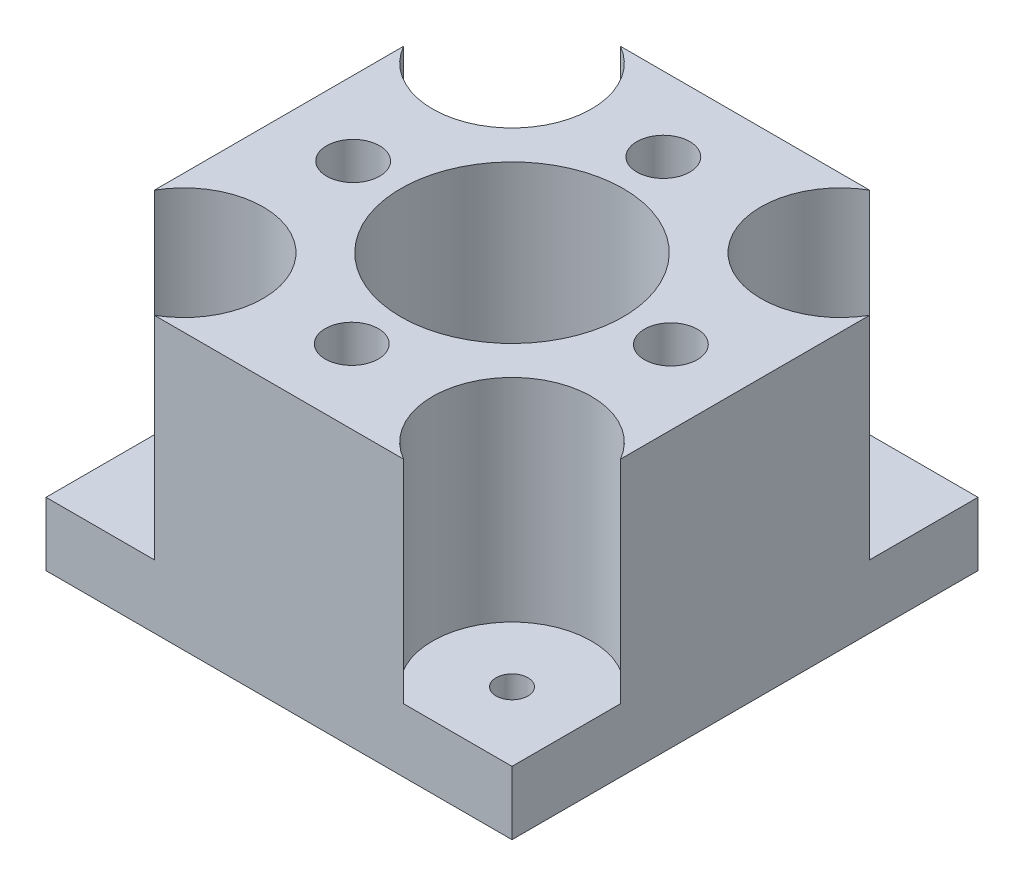
ISO-10303-21;
HEADER;
FILE_DESCRIPTION(('STEP AP214'),'2;1');
FILE_NAME('part.step','',(''),(''),'','','');
FILE_SCHEMA(('AUTOMOTIVE_DESIGN { 1 0 10303 214 1 1 1 1 }'));
ENDSEC;
DATA;
#1=APPLICATION_CONTEXT('core data for automotive mechanical design processes');
#2=APPLICATION_PROTOCOL_DEFINITION('international standard','automotive_design',2000,#1);
#3=PRODUCT_CONTEXT('',#1,'mechanical');
#4=PRODUCT('Part','Part','',(#3));
#5=PRODUCT_RELATED_PRODUCT_CATEGORY('part','',(#4));
#6=PRODUCT_DEFINITION_FORMATION('','',#4);
#7=PRODUCT_DEFINITION_CONTEXT('part definition',#1,'design');
#8=PRODUCT_DEFINITION('design','',#6,#7);
#9=PRODUCT_DEFINITION_SHAPE('','',#8);
#10=(LENGTH_UNIT() NAMED_UNIT(*) SI_UNIT(.MILLI.,.METRE.));
#11=(NAMED_UNIT(*) PLANE_ANGLE_UNIT() SI_UNIT($,.RADIAN.));
#12=(NAMED_UNIT(*) SI_UNIT($,.STERADIAN.) SOLID_ANGLE_UNIT());
#13=UNCERTAINTY_MEASURE_WITH_UNIT(LENGTH_MEASURE(1.E-05),#10,'distance_accuracy_value','');
#14=(GEOMETRIC_REPRESENTATION_CONTEXT(3) GLOBAL_UNCERTAINTY_ASSIGNED_CONTEXT((#13)) GLOBAL_UNIT_ASSIGNED_CONTEXT((#10,
#11,#12)) REPRESENTATION_CONTEXT('',''));
#15=CARTESIAN_POINT('',(0.,0.,0.));
#16=DIRECTION('',(0.,0.,1.));
#17=DIRECTION('',(1.,0.,0.));
#18=AXIS2_PLACEMENT_3D('',#15,#16,#17);
#19=CARTESIAN_POINT('',(0.,0.,0.));
#20=DIRECTION('',(0.,-1.,0.));
#21=DIRECTION('',(0.,0.,-1.));
#22=AXIS2_PLACEMENT_3D('',#19,#20,#21);
#23=PLANE('',#22);
#24=CARTESIAN_POINT('',(15.,0.,0.));
#25=DIRECTION('',(0.,-1.,0.));
#26=DIRECTION('',(0.,0.,-1.));
#27=AXIS2_PLACEMENT_3D('',#24,#25,#26);
#28=CIRCLE('',#27,2.5);
#29=CARTESIAN_POINT('',(15.,0.,-2.5));
#30=VERTEX_POINT('',#29);
#31=EDGE_CURVE('E259',#30,#30,#28,.T.);
#32=ORIENTED_EDGE('',*,*,#31,.F.);
#33=EDGE_LOOP('',(#32));
#34=FACE_BOUND('',#33,.T.);
#35=CARTESIAN_POINT('',(-15.,0.,0.));
#36=DIRECTION('',(0.,-1.,0.));
#37=DIRECTION('',(0.,0.,-1.));
#38=AXIS2_PLACEMENT_3D('',#35,#36,#37);
#39=CIRCLE('',#38,2.5);
#40=CARTESIAN_POINT('',(-15.,0.,-2.5));
#41=VERTEX_POINT('',#40);
#42=EDGE_CURVE('E309',#41,#41,#39,.T.);
#43=ORIENTED_EDGE('',*,*,#42,.F.);
#44=EDGE_LOOP('',(#43));
#45=FACE_BOUND('',#44,.T.);
#46=CARTESIAN_POINT('',(-0.695414312257709,0.,-14.9838712933043));
#47=DIRECTION('',(0.,-1.,0.));
#48=DIRECTION('',(0.,0.,-1.));
#49=AXIS2_PLACEMENT_3D('',#46,#47,#48);
#50=CIRCLE('',#49,2.5);
#51=CARTESIAN_POINT('',(-0.695414312257709,0.,-17.4838712933043));
#52=VERTEX_POINT('',#51);
#53=EDGE_CURVE('E306',#52,#52,#50,.T.);
#54=ORIENTED_EDGE('',*,*,#53,.F.);
#55=EDGE_LOOP('',(#54));
#56=FACE_BOUND('',#55,.T.);
#57=CARTESIAN_POINT('',(-0.115302399352741,0.,15.0161287066957));
#58=DIRECTION('',(0.,-1.,0.));
#59=DIRECTION('',(0.,0.,-1.));
#60=AXIS2_PLACEMENT_3D('',#57,#58,#59);
#61=CIRCLE('',#60,2.5);
#62=CARTESIAN_POINT('',(-0.115302399352741,0.,12.5161287066957));
#63=VERTEX_POINT('',#62);
#64=EDGE_CURVE('E295',#63,#63,#61,.T.);
#65=ORIENTED_EDGE('',*,*,#64,.F.);
#66=EDGE_LOOP('',(#65));
#67=FACE_BOUND('',#66,.T.);
#68=CARTESIAN_POINT('',(0.,0.,0.));
#69=DIRECTION('',(0.,-1.,0.));
#70=DIRECTION('',(0.,0.,-1.));
#71=AXIS2_PLACEMENT_3D('',#68,#69,#70);
#72=CIRCLE('',#71,10.5);
#73=CARTESIAN_POINT('',(0.,0.,-10.5));
#74=VERTEX_POINT('',#73);
#75=EDGE_CURVE('E164',#74,#74,#72,.T.);
#76=ORIENTED_EDGE('',*,*,#75,.F.);
#77=EDGE_LOOP('',(#76));
#78=FACE_BOUND('',#77,.T.);
#79=CARTESIAN_POINT('',(15.5,0.,15.5));
#80=DIRECTION('',(0.,1.,0.));
#81=DIRECTION('',(0.,0.,1.));
#82=AXIS2_PLACEMENT_3D('',#79,#80,#81);
#83=CIRCLE('',#82,1.5);
#84=CARTESIAN_POINT('',(15.5,0.,17.));
#85=VERTEX_POINT('',#84);
#86=EDGE_CURVE('E167',#85,#85,#83,.T.);
#87=ORIENTED_EDGE('',*,*,#86,.T.);
#88=EDGE_LOOP('',(#87));
#89=FACE_BOUND('',#88,.T.);
#90=CARTESIAN_POINT('',(15.5,0.,-15.5));
#91=DIRECTION('',(0.,1.,0.));
#92=DIRECTION('',(0.,0.,1.));
#93=AXIS2_PLACEMENT_3D('',#90,#91,#92);
#94=CIRCLE('',#93,1.5);
#95=CARTESIAN_POINT('',(15.5,0.,-14.));
#96=VERTEX_POINT('',#95);
#97=EDGE_CURVE('E208',#96,#96,#94,.T.);
#98=ORIENTED_EDGE('',*,*,#97,.T.);
#99=EDGE_LOOP('',(#98));
#100=FACE_BOUND('',#99,.T.);
#101=DIRECTION('',(0.,0.,-1.));
#102=VECTOR('',#101,1.);
#103=CARTESIAN_POINT('',(22.,0.,22.));
#104=LINE('',#103,#102);
#105=CARTESIAN_POINT('',(22.,0.,22.));
#106=VERTEX_POINT('',#105);
#107=CARTESIAN_POINT('',(22.,0.,-22.));
#108=VERTEX_POINT('',#107);
#109=EDGE_CURVE('E214',#106,#108,#104,.T.);
#110=ORIENTED_EDGE('',*,*,#109,.F.);
#111=DIRECTION('',(1.,0.,0.));
#112=VECTOR('',#111,1.);
#113=CARTESIAN_POINT('',(-22.,0.,22.));
#114=LINE('',#113,#112);
#115=CARTESIAN_POINT('',(-22.,0.,22.));
#116=VERTEX_POINT('',#115);
#117=EDGE_CURVE('E220',#116,#106,#114,.T.);
#118=ORIENTED_EDGE('',*,*,#117,.F.);
#119=DIRECTION('',(0.,0.,1.));
#120=VECTOR('',#119,1.);
#121=CARTESIAN_POINT('',(-22.,0.,22.));
#122=LINE('',#121,#120);
#123=CARTESIAN_POINT('',(-22.,0.,-22.));
#124=VERTEX_POINT('',#123);
#125=EDGE_CURVE('E218',#124,#116,#122,.T.);
#126=ORIENTED_EDGE('',*,*,#125,.F.);
#127=DIRECTION('',(-1.,0.,0.));
#128=VECTOR('',#127,1.);
#129=CARTESIAN_POINT('',(-22.,0.,-22.));
#130=LINE('',#129,#128);
#131=EDGE_CURVE('E153',#108,#124,#130,.T.);
#132=ORIENTED_EDGE('',*,*,#131,.F.);
#133=EDGE_LOOP('',(#110,#118,#126,#132));
#134=FACE_BOUND('',#133,.T.);
#135=CARTESIAN_POINT('',(-15.5,0.,-15.5));
#136=DIRECTION('',(0.,1.,0.));
#137=DIRECTION('',(0.,0.,1.));
#138=AXIS2_PLACEMENT_3D('',#135,#136,#137);
#139=CIRCLE('',#138,1.5);
#140=CARTESIAN_POINT('',(-15.5,0.,-14.));
#141=VERTEX_POINT('',#140);
#142=EDGE_CURVE('E211',#141,#141,#139,.T.);
#143=ORIENTED_EDGE('',*,*,#142,.T.);
#144=EDGE_LOOP('',(#143));
#145=FACE_BOUND('',#144,.T.);
#146=CARTESIAN_POINT('',(-15.5,0.,15.5));
#147=DIRECTION('',(0.,1.,0.));
#148=DIRECTION('',(0.,0.,1.));
#149=AXIS2_PLACEMENT_3D('',#146,#147,#148);
#150=CIRCLE('',#149,1.5);
#151=CARTESIAN_POINT('',(-15.5,0.,17.));
#152=VERTEX_POINT('',#151);
#153=EDGE_CURVE('E205',#152,#152,#150,.T.);
#154=ORIENTED_EDGE('',*,*,#153,.T.);
#155=EDGE_LOOP('',(#154));
#156=FACE_BOUND('',#155,.T.);
#157=ADVANCED_FACE('F37',(#34,#45,#56,#67,#78,#89,#100,#134,#145,#156),#23,.T.);
#158=CARTESIAN_POINT('',(22.,3.,22.));
#159=DIRECTION('',(-1.,0.,0.));
#160=DIRECTION('',(0.,0.,1.));
#161=AXIS2_PLACEMENT_3D('',#158,#159,#160);
#162=PLANE('',#161);
#163=DIRECTION('',(0.,0.,-1.));
#164=VECTOR('',#163,1.);
#165=CARTESIAN_POINT('',(22.,26.,22.));
#166=LINE('',#165,#164);
#167=CARTESIAN_POINT('',(22.,26.,11.7583426132261));
#168=VERTEX_POINT('',#167);
#169=CARTESIAN_POINT('',(22.,26.,-11.7583426132261));
#170=VERTEX_POINT('',#169);
#171=EDGE_CURVE('E194',#168,#170,#166,.T.);
#172=ORIENTED_EDGE('',*,*,#171,.F.);
#173=DIRECTION('',(0.,1.,0.));
#174=VECTOR('',#173,1.);
#175=CARTESIAN_POINT('',(22.,6.,11.7583426132261));
#176=LINE('',#175,#174);
#177=CARTESIAN_POINT('',(22.,6.,11.7583426132261));
#178=VERTEX_POINT('',#177);
#179=EDGE_CURVE('E60',#168,#178,#176,.F.);
#180=ORIENTED_EDGE('',*,*,#179,.T.);
#181=DIRECTION('',(0.,0.,-1.));
#182=VECTOR('',#181,1.);
#183=CARTESIAN_POINT('',(22.,6.,22.));
#184=LINE('',#183,#182);
#185=CARTESIAN_POINT('',(22.,6.,22.));
#186=VERTEX_POINT('',#185);
#187=EDGE_CURVE('E225',#186,#178,#184,.T.);
#188=ORIENTED_EDGE('',*,*,#187,.F.);
#189=DIRECTION('',(0.,-1.,0.));
#190=VECTOR('',#189,1.);
#191=CARTESIAN_POINT('',(22.,3.,22.));
#192=LINE('',#191,#190);
#193=EDGE_CURVE('E160',#186,#106,#192,.T.);
#194=ORIENTED_EDGE('',*,*,#193,.T.);
#195=ORIENTED_EDGE('',*,*,#109,.T.);
#196=DIRECTION('',(0.,-1.,0.));
#197=VECTOR('',#196,1.);
#198=CARTESIAN_POINT('',(22.,3.,-22.));
#199=LINE('',#198,#197);
#200=CARTESIAN_POINT('',(22.,6.,-22.));
#201=VERTEX_POINT('',#200);
#202=EDGE_CURVE('E155',#201,#108,#199,.T.);
#203=ORIENTED_EDGE('',*,*,#202,.F.);
#204=DIRECTION('',(0.,0.,-1.));
#205=VECTOR('',#204,1.);
#206=CARTESIAN_POINT('',(22.,6.,22.));
#207=LINE('',#206,#205);
#208=CARTESIAN_POINT('',(22.,6.,-11.7583426132261));
#209=VERTEX_POINT('',#208);
#210=EDGE_CURVE('E137',#209,#201,#207,.T.);
#211=ORIENTED_EDGE('',*,*,#210,.F.);
#212=DIRECTION('',(0.,1.,0.));
#213=VECTOR('',#212,1.);
#214=CARTESIAN_POINT('',(22.,6.,-11.7583426132261));
#215=LINE('',#214,#213);
#216=EDGE_CURVE('E188',#209,#170,#215,.T.);
#217=ORIENTED_EDGE('',*,*,#216,.T.);
#218=EDGE_LOOP('',(#172,#180,#188,#194,#195,#203,#211,#217));
#219=FACE_BOUND('',#218,.T.);
#220=ADVANCED_FACE('F39',(#219),#162,.F.);
#221=CARTESIAN_POINT('',(-22.,3.,-22.));
#222=DIRECTION('',(0.,0.,1.));
#223=DIRECTION('',(1.,0.,0.));
#224=AXIS2_PLACEMENT_3D('',#221,#222,#223);
#225=PLANE('',#224);
#226=DIRECTION('',(-1.,0.,0.));
#227=VECTOR('',#226,1.);
#228=CARTESIAN_POINT('',(22.,26.,-22.));
#229=LINE('',#228,#227);
#230=CARTESIAN_POINT('',(11.7583426132261,26.,-22.));
#231=VERTEX_POINT('',#230);
#232=CARTESIAN_POINT('',(-11.7583426132261,26.,-22.));
#233=VERTEX_POINT('',#232);
#234=EDGE_CURVE('E168',#231,#233,#229,.T.);
#235=ORIENTED_EDGE('',*,*,#234,.F.);
#236=DIRECTION('',(0.,1.,0.));
#237=VECTOR('',#236,1.);
#238=CARTESIAN_POINT('',(11.7583426132261,6.,-22.));
#239=LINE('',#238,#237);
#240=CARTESIAN_POINT('',(11.7583426132261,6.,-22.));
#241=VERTEX_POINT('',#240);
#242=EDGE_CURVE('E52',#231,#241,#239,.F.);
#243=ORIENTED_EDGE('',*,*,#242,.T.);
#244=DIRECTION('',(-1.,0.,0.));
#245=VECTOR('',#244,1.);
#246=CARTESIAN_POINT('',(22.,6.,-22.));
#247=LINE('',#246,#245);
#248=EDGE_CURVE('E246',#201,#241,#247,.T.);
#249=ORIENTED_EDGE('',*,*,#248,.F.);
#250=ORIENTED_EDGE('',*,*,#202,.T.);
#251=ORIENTED_EDGE('',*,*,#131,.T.);
#252=DIRECTION('',(0.,-1.,0.));
#253=VECTOR('',#252,1.);
#254=CARTESIAN_POINT('',(-22.,3.,-22.));
#255=LINE('',#254,#253);
#256=CARTESIAN_POINT('',(-22.,6.,-22.));
#257=VERTEX_POINT('',#256);
#258=EDGE_CURVE('E144',#257,#124,#255,.T.);
#259=ORIENTED_EDGE('',*,*,#258,.F.);
#260=DIRECTION('',(-1.,0.,0.));
#261=VECTOR('',#260,1.);
#262=CARTESIAN_POINT('',(-22.,6.,-22.));
#263=LINE('',#262,#261);
#264=CARTESIAN_POINT('',(-11.7583426132261,6.,-22.));
#265=VERTEX_POINT('',#264);
#266=EDGE_CURVE('E127',#265,#257,#263,.T.);
#267=ORIENTED_EDGE('',*,*,#266,.F.);
#268=DIRECTION('',(0.,1.,0.));
#269=VECTOR('',#268,1.);
#270=CARTESIAN_POINT('',(-11.7583426132261,6.,-22.));
#271=LINE('',#270,#269);
#272=EDGE_CURVE('E264',#265,#233,#271,.T.);
#273=ORIENTED_EDGE('',*,*,#272,.T.);
#274=EDGE_LOOP('',(#235,#243,#249,#250,#251,#259,#267,#273));
#275=FACE_BOUND('',#274,.T.);
#276=ADVANCED_FACE('F151',(#275),#225,.F.);
#277=CARTESIAN_POINT('',(-22.,3.,22.));
#278=DIRECTION('',(1.,0.,0.));
#279=DIRECTION('',(0.,0.,-1.));
#280=AXIS2_PLACEMENT_3D('',#277,#278,#279);
#281=PLANE('',#280);
#282=DIRECTION('',(0.,0.,1.));
#283=VECTOR('',#282,1.);
#284=CARTESIAN_POINT('',(-22.,6.,22.));
#285=LINE('',#284,#283);
#286=CARTESIAN_POINT('',(-22.,6.,11.7583426132261));
#287=VERTEX_POINT('',#286);
#288=CARTESIAN_POINT('',(-22.,6.,22.));
#289=VERTEX_POINT('',#288);
#290=EDGE_CURVE('E138',#287,#289,#285,.T.);
#291=ORIENTED_EDGE('',*,*,#290,.F.);
#292=DIRECTION('',(0.,1.,0.));
#293=VECTOR('',#292,1.);
#294=CARTESIAN_POINT('',(-22.,6.,11.7583426132261));
#295=LINE('',#294,#293);
#296=CARTESIAN_POINT('',(-22.,26.,11.7583426132261));
#297=VERTEX_POINT('',#296);
#298=EDGE_CURVE('E232',#287,#297,#295,.T.);
#299=ORIENTED_EDGE('',*,*,#298,.T.);
#300=DIRECTION('',(0.,0.,1.));
#301=VECTOR('',#300,1.);
#302=CARTESIAN_POINT('',(-22.,26.,-22.));
#303=LINE('',#302,#301);
#304=CARTESIAN_POINT('',(-22.,26.,-11.7583426132261));
#305=VERTEX_POINT('',#304);
#306=EDGE_CURVE('E195',#305,#297,#303,.T.);
#307=ORIENTED_EDGE('',*,*,#306,.F.);
#308=DIRECTION('',(0.,1.,0.));
#309=VECTOR('',#308,1.);
#310=CARTESIAN_POINT('',(-22.,6.,-11.7583426132261));
#311=LINE('',#310,#309);
#312=CARTESIAN_POINT('',(-22.,6.,-11.7583426132261));
#313=VERTEX_POINT('',#312);
#314=EDGE_CURVE('E147',#305,#313,#311,.F.);
#315=ORIENTED_EDGE('',*,*,#314,.T.);
#316=DIRECTION('',(0.,0.,1.));
#317=VECTOR('',#316,1.);
#318=CARTESIAN_POINT('',(-22.,6.,-22.));
#319=LINE('',#318,#317);
#320=EDGE_CURVE('E131',#257,#313,#319,.T.);
#321=ORIENTED_EDGE('',*,*,#320,.F.);
#322=ORIENTED_EDGE('',*,*,#258,.T.);
#323=ORIENTED_EDGE('',*,*,#125,.T.);
#324=DIRECTION('',(0.,-1.,0.));
#325=VECTOR('',#324,1.);
#326=CARTESIAN_POINT('',(-22.,3.,22.));
#327=LINE('',#326,#325);
#328=EDGE_CURVE('E156',#289,#116,#327,.T.);
#329=ORIENTED_EDGE('',*,*,#328,.F.);
#330=EDGE_LOOP('',(#291,#299,#307,#315,#321,#322,#323,#329));
#331=FACE_BOUND('',#330,.T.);
#332=ADVANCED_FACE('F142',(#331),#281,.F.);
#333=CARTESIAN_POINT('',(-22.,3.,22.));
#334=DIRECTION('',(0.,0.,-1.));
#335=DIRECTION('',(-1.,0.,0.));
#336=AXIS2_PLACEMENT_3D('',#333,#334,#335);
#337=PLANE('',#336);
#338=DIRECTION('',(1.,0.,0.));
#339=VECTOR('',#338,1.);
#340=CARTESIAN_POINT('',(-22.,26.,22.));
#341=LINE('',#340,#339);
#342=CARTESIAN_POINT('',(-11.7583426132261,26.,22.));
#343=VERTEX_POINT('',#342);
#344=CARTESIAN_POINT('',(11.7583426132261,26.,22.));
#345=VERTEX_POINT('',#344);
#346=EDGE_CURVE('E184',#343,#345,#341,.T.);
#347=ORIENTED_EDGE('',*,*,#346,.F.);
#348=DIRECTION('',(0.,1.,0.));
#349=VECTOR('',#348,1.);
#350=CARTESIAN_POINT('',(-11.7583426132261,6.,22.));
#351=LINE('',#350,#349);
#352=CARTESIAN_POINT('',(-11.7583426132261,6.,22.));
#353=VERTEX_POINT('',#352);
#354=EDGE_CURVE('E269',#343,#353,#351,.F.);
#355=ORIENTED_EDGE('',*,*,#354,.T.);
#356=DIRECTION('',(1.,0.,0.));
#357=VECTOR('',#356,1.);
#358=CARTESIAN_POINT('',(-22.,6.,22.));
#359=LINE('',#358,#357);
#360=EDGE_CURVE('E255',#289,#353,#359,.T.);
#361=ORIENTED_EDGE('',*,*,#360,.F.);
#362=ORIENTED_EDGE('',*,*,#328,.T.);
#363=ORIENTED_EDGE('',*,*,#117,.T.);
#364=ORIENTED_EDGE('',*,*,#193,.F.);
#365=DIRECTION('',(1.,0.,0.));
#366=VECTOR('',#365,1.);
#367=CARTESIAN_POINT('',(22.,6.,22.));
#368=LINE('',#367,#366);
#369=CARTESIAN_POINT('',(11.7583426132261,6.,22.));
#370=VERTEX_POINT('',#369);
#371=EDGE_CURVE('E187',#370,#186,#368,.T.);
#372=ORIENTED_EDGE('',*,*,#371,.F.);
#373=DIRECTION('',(0.,1.,0.));
#374=VECTOR('',#373,1.);
#375=CARTESIAN_POINT('',(11.7583426132261,6.,22.));
#376=LINE('',#375,#374);
#377=EDGE_CURVE('E174',#370,#345,#376,.T.);
#378=ORIENTED_EDGE('',*,*,#377,.T.);
#379=EDGE_LOOP('',(#347,#355,#361,#362,#363,#364,#372,#378));
#380=FACE_BOUND('',#379,.T.);
#381=ADVANCED_FACE('F182',(#380),#337,.F.);
#382=CARTESIAN_POINT('',(-15.5,3.,-15.5));
#383=DIRECTION('',(0.,-1.,0.));
#384=DIRECTION('',(0.,0.,-1.));
#385=AXIS2_PLACEMENT_3D('',#382,#383,#384);
#386=CYLINDRICAL_SURFACE('',#385,1.5);
#387=ORIENTED_EDGE('',*,*,#142,.F.);
#388=EDGE_LOOP('',(#387));
#389=FACE_BOUND('',#388,.T.);
#390=CARTESIAN_POINT('',(-15.5,6.,-15.5));
#391=DIRECTION('',(0.,1.,0.));
#392=DIRECTION('',(0.,0.,1.));
#393=AXIS2_PLACEMENT_3D('',#390,#391,#392);
#394=CIRCLE('',#393,1.5);
#395=CARTESIAN_POINT('',(-15.5,6.,-14.));
#396=VERTEX_POINT('',#395);
#397=EDGE_CURVE('E280',#396,#396,#394,.T.);
#398=ORIENTED_EDGE('',*,*,#397,.T.);
#399=EDGE_LOOP('',(#398));
#400=FACE_BOUND('',#399,.T.);
#401=ADVANCED_FACE('F337',(#389,#400),#386,.F.);
#402=CARTESIAN_POINT('',(15.5,3.,-15.5));
#403=DIRECTION('',(0.,-1.,0.));
#404=DIRECTION('',(0.,0.,-1.));
#405=AXIS2_PLACEMENT_3D('',#402,#403,#404);
#406=CYLINDRICAL_SURFACE('',#405,1.5);
#407=ORIENTED_EDGE('',*,*,#97,.F.);
#408=EDGE_LOOP('',(#407));
#409=FACE_BOUND('',#408,.T.);
#410=CARTESIAN_POINT('',(15.5,6.,-15.5));
#411=DIRECTION('',(0.,1.,0.));
#412=DIRECTION('',(0.,0.,1.));
#413=AXIS2_PLACEMENT_3D('',#410,#411,#412);
#414=CIRCLE('',#413,1.5);
#415=CARTESIAN_POINT('',(15.5,6.,-14.));
#416=VERTEX_POINT('',#415);
#417=EDGE_CURVE('E283',#416,#416,#414,.T.);
#418=ORIENTED_EDGE('',*,*,#417,.T.);
#419=EDGE_LOOP('',(#418));
#420=FACE_BOUND('',#419,.T.);
#421=ADVANCED_FACE('F333',(#409,#420),#406,.F.);
#422=CARTESIAN_POINT('',(-15.5,3.,15.5));
#423=DIRECTION('',(0.,-1.,0.));
#424=DIRECTION('',(0.,0.,-1.));
#425=AXIS2_PLACEMENT_3D('',#422,#423,#424);
#426=CYLINDRICAL_SURFACE('',#425,1.5);
#427=ORIENTED_EDGE('',*,*,#153,.F.);
#428=EDGE_LOOP('',(#427));
#429=FACE_BOUND('',#428,.T.);
#430=CARTESIAN_POINT('',(-15.5,6.,15.5));
#431=DIRECTION('',(0.,1.,0.));
#432=DIRECTION('',(0.,0.,1.));
#433=AXIS2_PLACEMENT_3D('',#430,#431,#432);
#434=CIRCLE('',#433,1.5);
#435=CARTESIAN_POINT('',(-15.5,6.,17.));
#436=VERTEX_POINT('',#435);
#437=EDGE_CURVE('E278',#436,#436,#434,.T.);
#438=ORIENTED_EDGE('',*,*,#437,.T.);
#439=EDGE_LOOP('',(#438));
#440=FACE_BOUND('',#439,.T.);
#441=ADVANCED_FACE('F336',(#429,#440),#426,.F.);
#442=CARTESIAN_POINT('',(15.5,3.,15.5));
#443=DIRECTION('',(0.,-1.,0.));
#444=DIRECTION('',(0.,0.,-1.));
#445=AXIS2_PLACEMENT_3D('',#442,#443,#444);
#446=CYLINDRICAL_SURFACE('',#445,1.5);
#447=ORIENTED_EDGE('',*,*,#86,.F.);
#448=EDGE_LOOP('',(#447));
#449=FACE_BOUND('',#448,.T.);
#450=CARTESIAN_POINT('',(15.5,6.,15.5));
#451=DIRECTION('',(0.,1.,0.));
#452=DIRECTION('',(0.,0.,1.));
#453=AXIS2_PLACEMENT_3D('',#450,#451,#452);
#454=CIRCLE('',#453,1.5);
#455=CARTESIAN_POINT('',(15.5,6.,17.));
#456=VERTEX_POINT('',#455);
#457=EDGE_CURVE('E288',#456,#456,#454,.T.);
#458=ORIENTED_EDGE('',*,*,#457,.T.);
#459=EDGE_LOOP('',(#458));
#460=FACE_BOUND('',#459,.T.);
#461=ADVANCED_FACE('F368',(#449,#460),#446,.F.);
#462=CARTESIAN_POINT('',(0.,-17.,0.));
#463=DIRECTION('',(0.,1.,0.));
#464=DIRECTION('',(0.,0.,1.));
#465=AXIS2_PLACEMENT_3D('',#462,#463,#464);
#466=CYLINDRICAL_SURFACE('',#465,10.5);
#467=ORIENTED_EDGE('',*,*,#75,.T.);
#468=EDGE_LOOP('',(#467));
#469=FACE_BOUND('',#468,.T.);
#470=CARTESIAN_POINT('',(0.,26.,0.));
#471=DIRECTION('',(0.,1.,0.));
#472=DIRECTION('',(0.,0.,1.));
#473=AXIS2_PLACEMENT_3D('',#470,#471,#472);
#474=CIRCLE('',#473,10.5);
#475=CARTESIAN_POINT('',(0.,26.,10.5));
#476=VERTEX_POINT('',#475);
#477=EDGE_CURVE('E148',#476,#476,#474,.T.);
#478=ORIENTED_EDGE('',*,*,#477,.T.);
#479=EDGE_LOOP('',(#478));
#480=FACE_BOUND('',#479,.T.);
#481=ADVANCED_FACE('F364',(#469,#480),#466,.F.);
#482=CARTESIAN_POINT('',(0.,26.,0.));
#483=DIRECTION('',(0.,1.,0.));
#484=DIRECTION('',(0.,0.,1.));
#485=AXIS2_PLACEMENT_3D('',#482,#483,#484);
#486=PLANE('',#485);
#487=CARTESIAN_POINT('',(15.,26.,0.));
#488=DIRECTION('',(0.,1.,0.));
#489=DIRECTION('',(0.,0.,1.));
#490=AXIS2_PLACEMENT_3D('',#487,#488,#489);
#491=CIRCLE('',#490,2.5);
#492=CARTESIAN_POINT('',(15.,26.,2.5));
#493=VERTEX_POINT('',#492);
#494=EDGE_CURVE('E292',#493,#493,#491,.T.);
#495=ORIENTED_EDGE('',*,*,#494,.F.);
#496=EDGE_LOOP('',(#495));
#497=FACE_BOUND('',#496,.T.);
#498=CARTESIAN_POINT('',(-15.,26.,0.));
#499=DIRECTION('',(0.,1.,0.));
#500=DIRECTION('',(0.,0.,1.));
#501=AXIS2_PLACEMENT_3D('',#498,#499,#500);
#502=CIRCLE('',#501,2.5);
#503=CARTESIAN_POINT('',(-15.,26.,2.5));
#504=VERTEX_POINT('',#503);
#505=EDGE_CURVE('E296',#504,#504,#502,.T.);
#506=ORIENTED_EDGE('',*,*,#505,.F.);
#507=EDGE_LOOP('',(#506));
#508=FACE_BOUND('',#507,.T.);
#509=CARTESIAN_POINT('',(-0.695414312257709,26.,-14.9838712933043));
#510=DIRECTION('',(0.,1.,0.));
#511=DIRECTION('',(0.,0.,1.));
#512=AXIS2_PLACEMENT_3D('',#509,#510,#511);
#513=CIRCLE('',#512,2.5);
#514=CARTESIAN_POINT('',(-0.695414312257709,26.,-12.4838712933042));
#515=VERTEX_POINT('',#514);
#516=EDGE_CURVE('E299',#515,#515,#513,.T.);
#517=ORIENTED_EDGE('',*,*,#516,.F.);
#518=EDGE_LOOP('',(#517));
#519=FACE_BOUND('',#518,.T.);
#520=CARTESIAN_POINT('',(-0.115302399352741,26.,15.0161287066957));
#521=DIRECTION('',(0.,1.,0.));
#522=DIRECTION('',(0.,0.,1.));
#523=AXIS2_PLACEMENT_3D('',#520,#521,#522);
#524=CIRCLE('',#523,2.5);
#525=CARTESIAN_POINT('',(-0.115302399352741,26.,17.5161287066957));
#526=VERTEX_POINT('',#525);
#527=EDGE_CURVE('E291',#526,#526,#524,.T.);
#528=ORIENTED_EDGE('',*,*,#527,.F.);
#529=EDGE_LOOP('',(#528));
#530=FACE_BOUND('',#529,.T.);
#531=CARTESIAN_POINT('',(-15.5,26.,15.5));
#532=DIRECTION('',(0.,1.,0.));
#533=DIRECTION('',(0.,0.,1.));
#534=AXIS2_PLACEMENT_3D('',#531,#532,#533);
#535=CIRCLE('',#534,7.5);
#536=EDGE_CURVE('E11',#343,#297,#535,.T.);
#537=ORIENTED_EDGE('',*,*,#536,.F.);
#538=ORIENTED_EDGE('',*,*,#346,.T.);
#539=CARTESIAN_POINT('',(15.5,26.,15.5));
#540=DIRECTION('',(0.,1.,0.));
#541=DIRECTION('',(0.,0.,1.));
#542=AXIS2_PLACEMENT_3D('',#539,#540,#541);
#543=CIRCLE('',#542,7.5);
#544=EDGE_CURVE('E45',#168,#345,#543,.T.);
#545=ORIENTED_EDGE('',*,*,#544,.F.);
#546=ORIENTED_EDGE('',*,*,#171,.T.);
#547=CARTESIAN_POINT('',(15.5,26.,-15.5));
#548=DIRECTION('',(0.,1.,0.));
#549=DIRECTION('',(0.,0.,1.));
#550=AXIS2_PLACEMENT_3D('',#547,#548,#549);
#551=CIRCLE('',#550,7.5);
#552=EDGE_CURVE('E170',#231,#170,#551,.T.);
#553=ORIENTED_EDGE('',*,*,#552,.F.);
#554=ORIENTED_EDGE('',*,*,#234,.T.);
#555=CARTESIAN_POINT('',(-15.5,26.,-15.5));
#556=DIRECTION('',(0.,1.,0.));
#557=DIRECTION('',(0.,0.,1.));
#558=AXIS2_PLACEMENT_3D('',#555,#556,#557);
#559=CIRCLE('',#558,7.5);
#560=EDGE_CURVE('E158',#305,#233,#559,.T.);
#561=ORIENTED_EDGE('',*,*,#560,.F.);
#562=ORIENTED_EDGE('',*,*,#306,.T.);
#563=EDGE_LOOP('',(#537,#538,#545,#546,#553,#554,#561,#562));
#564=FACE_BOUND('',#563,.T.);
#565=ORIENTED_EDGE('',*,*,#477,.F.);
#566=EDGE_LOOP('',(#565));
#567=FACE_BOUND('',#566,.T.);
#568=ADVANCED_FACE('F191',(#497,#508,#519,#530,#564,#567),#486,.T.);
#569=CARTESIAN_POINT('',(-15.5,6.,-15.5));
#570=DIRECTION('',(0.,1.,0.));
#571=DIRECTION('',(0.,0.,1.));
#572=AXIS2_PLACEMENT_3D('',#569,#570,#571);
#573=PLANE('',#572);
#574=ORIENTED_EDGE('',*,*,#320,.T.);
#575=CARTESIAN_POINT('',(-15.5,6.,-15.5));
#576=DIRECTION('',(0.,1.,0.));
#577=DIRECTION('',(0.,0.,1.));
#578=AXIS2_PLACEMENT_3D('',#575,#576,#577);
#579=CIRCLE('',#578,7.5);
#580=EDGE_CURVE('E133',#313,#265,#579,.T.);
#581=ORIENTED_EDGE('',*,*,#580,.T.);
#582=ORIENTED_EDGE('',*,*,#266,.T.);
#583=EDGE_LOOP('',(#574,#581,#582));
#584=FACE_BOUND('',#583,.T.);
#585=ORIENTED_EDGE('',*,*,#397,.F.);
#586=EDGE_LOOP('',(#585));
#587=FACE_BOUND('',#586,.T.);
#588=ADVANCED_FACE('F129',(#584,#587),#573,.T.);
#589=CARTESIAN_POINT('',(-15.5,6.,-15.5));
#590=DIRECTION('',(0.,1.,0.));
#591=DIRECTION('',(0.,0.,1.));
#592=AXIS2_PLACEMENT_3D('',#589,#590,#591);
#593=CYLINDRICAL_SURFACE('',#592,7.5);
#594=ORIENTED_EDGE('',*,*,#580,.F.);
#595=ORIENTED_EDGE('',*,*,#314,.F.);
#596=ORIENTED_EDGE('',*,*,#560,.T.);
#597=ORIENTED_EDGE('',*,*,#272,.F.);
#598=EDGE_LOOP('',(#594,#595,#596,#597));
#599=FACE_BOUND('',#598,.T.);
#600=ADVANCED_FACE('F342',(#599),#593,.F.);
#601=CARTESIAN_POINT('',(15.5,6.,-15.5));
#602=DIRECTION('',(0.,1.,0.));
#603=DIRECTION('',(0.,0.,1.));
#604=AXIS2_PLACEMENT_3D('',#601,#602,#603);
#605=PLANE('',#604);
#606=ORIENTED_EDGE('',*,*,#248,.T.);
#607=CARTESIAN_POINT('',(15.5,6.,-15.5));
#608=DIRECTION('',(0.,1.,0.));
#609=DIRECTION('',(0.,0.,1.));
#610=AXIS2_PLACEMENT_3D('',#607,#608,#609);
#611=CIRCLE('',#610,7.5);
#612=EDGE_CURVE('E247',#241,#209,#611,.T.);
#613=ORIENTED_EDGE('',*,*,#612,.T.);
#614=ORIENTED_EDGE('',*,*,#210,.T.);
#615=EDGE_LOOP('',(#606,#613,#614));
#616=FACE_BOUND('',#615,.T.);
#617=ORIENTED_EDGE('',*,*,#417,.F.);
#618=EDGE_LOOP('',(#617));
#619=FACE_BOUND('',#618,.T.);
#620=ADVANCED_FACE('F244',(#616,#619),#605,.T.);
#621=CARTESIAN_POINT('',(15.5,6.,-15.5));
#622=DIRECTION('',(0.,1.,0.));
#623=DIRECTION('',(0.,0.,1.));
#624=AXIS2_PLACEMENT_3D('',#621,#622,#623);
#625=CYLINDRICAL_SURFACE('',#624,7.5);
#626=ORIENTED_EDGE('',*,*,#612,.F.);
#627=ORIENTED_EDGE('',*,*,#242,.F.);
#628=ORIENTED_EDGE('',*,*,#552,.T.);
#629=ORIENTED_EDGE('',*,*,#216,.F.);
#630=EDGE_LOOP('',(#626,#627,#628,#629));
#631=FACE_BOUND('',#630,.T.);
#632=ADVANCED_FACE('F341',(#631),#625,.F.);
#633=CARTESIAN_POINT('',(15.5,6.,15.5));
#634=DIRECTION('',(0.,1.,0.));
#635=DIRECTION('',(0.,0.,1.));
#636=AXIS2_PLACEMENT_3D('',#633,#634,#635);
#637=PLANE('',#636);
#638=CARTESIAN_POINT('',(15.5,6.,15.5));
#639=DIRECTION('',(0.,1.,0.));
#640=DIRECTION('',(0.,0.,1.));
#641=AXIS2_PLACEMENT_3D('',#638,#639,#640);
#642=CIRCLE('',#641,7.5);
#643=EDGE_CURVE('E253',#178,#370,#642,.T.);
#644=ORIENTED_EDGE('',*,*,#643,.T.);
#645=ORIENTED_EDGE('',*,*,#371,.T.);
#646=ORIENTED_EDGE('',*,*,#187,.T.);
#647=EDGE_LOOP('',(#644,#645,#646));
#648=FACE_BOUND('',#647,.T.);
#649=ORIENTED_EDGE('',*,*,#457,.F.);
#650=EDGE_LOOP('',(#649));
#651=FACE_BOUND('',#650,.T.);
#652=ADVANCED_FACE('F348',(#648,#651),#637,.T.);
#653=CARTESIAN_POINT('',(15.5,6.,15.5));
#654=DIRECTION('',(0.,1.,0.));
#655=DIRECTION('',(0.,0.,1.));
#656=AXIS2_PLACEMENT_3D('',#653,#654,#655);
#657=CYLINDRICAL_SURFACE('',#656,7.5);
#658=ORIENTED_EDGE('',*,*,#377,.F.);
#659=ORIENTED_EDGE('',*,*,#643,.F.);
#660=ORIENTED_EDGE('',*,*,#179,.F.);
#661=ORIENTED_EDGE('',*,*,#544,.T.);
#662=EDGE_LOOP('',(#658,#659,#660,#661));
#663=FACE_BOUND('',#662,.T.);
#664=ADVANCED_FACE('F173',(#663),#657,.F.);
#665=CARTESIAN_POINT('',(-15.5,6.,15.5));
#666=DIRECTION('',(0.,1.,0.));
#667=DIRECTION('',(0.,0.,1.));
#668=AXIS2_PLACEMENT_3D('',#665,#666,#667);
#669=PLANE('',#668);
#670=ORIENTED_EDGE('',*,*,#360,.T.);
#671=CARTESIAN_POINT('',(-15.5,6.,15.5));
#672=DIRECTION('',(0.,1.,0.));
#673=DIRECTION('',(0.,0.,1.));
#674=AXIS2_PLACEMENT_3D('',#671,#672,#673);
#675=CIRCLE('',#674,7.5);
#676=EDGE_CURVE('E257',#353,#287,#675,.T.);
#677=ORIENTED_EDGE('',*,*,#676,.T.);
#678=ORIENTED_EDGE('',*,*,#290,.T.);
#679=EDGE_LOOP('',(#670,#677,#678));
#680=FACE_BOUND('',#679,.T.);
#681=ORIENTED_EDGE('',*,*,#437,.F.);
#682=EDGE_LOOP('',(#681));
#683=FACE_BOUND('',#682,.T.);
#684=ADVANCED_FACE('F272',(#680,#683),#669,.T.);
#685=CARTESIAN_POINT('',(-15.5,6.,15.5));
#686=DIRECTION('',(0.,1.,0.));
#687=DIRECTION('',(0.,0.,1.));
#688=AXIS2_PLACEMENT_3D('',#685,#686,#687);
#689=CYLINDRICAL_SURFACE('',#688,7.5);
#690=ORIENTED_EDGE('',*,*,#676,.F.);
#691=ORIENTED_EDGE('',*,*,#354,.F.);
#692=ORIENTED_EDGE('',*,*,#536,.T.);
#693=ORIENTED_EDGE('',*,*,#298,.F.);
#694=EDGE_LOOP('',(#690,#691,#692,#693));
#695=FACE_BOUND('',#694,.T.);
#696=ADVANCED_FACE('F271',(#695),#689,.F.);
#697=CARTESIAN_POINT('',(-0.115302399352741,-7.00000000000001,15.0161287066957));
#698=DIRECTION('',(0.,1.,0.));
#699=DIRECTION('',(0.,0.,1.));
#700=AXIS2_PLACEMENT_3D('',#697,#698,#699);
#701=CYLINDRICAL_SURFACE('',#700,2.5);
#702=ORIENTED_EDGE('',*,*,#64,.T.);
#703=EDGE_LOOP('',(#702));
#704=FACE_BOUND('',#703,.T.);
#705=ORIENTED_EDGE('',*,*,#527,.T.);
#706=EDGE_LOOP('',(#705));
#707=FACE_BOUND('',#706,.T.);
#708=ADVANCED_FACE('F360',(#704,#707),#701,.F.);
#709=CARTESIAN_POINT('',(-0.695414312257709,-7.00000000000001,-14.9838712933043));
#710=DIRECTION('',(0.,1.,0.));
#711=DIRECTION('',(0.,0.,1.));
#712=AXIS2_PLACEMENT_3D('',#709,#710,#711);
#713=CYLINDRICAL_SURFACE('',#712,2.5);
#714=ORIENTED_EDGE('',*,*,#53,.T.);
#715=EDGE_LOOP('',(#714));
#716=FACE_BOUND('',#715,.T.);
#717=ORIENTED_EDGE('',*,*,#516,.T.);
#718=EDGE_LOOP('',(#717));
#719=FACE_BOUND('',#718,.T.);
#720=ADVANCED_FACE('F417',(#716,#719),#713,.F.);
#721=CARTESIAN_POINT('',(-15.,-7.00000000000001,0.));
#722=DIRECTION('',(0.,1.,0.));
#723=DIRECTION('',(0.,0.,1.));
#724=AXIS2_PLACEMENT_3D('',#721,#722,#723);
#725=CYLINDRICAL_SURFACE('',#724,2.5);
#726=ORIENTED_EDGE('',*,*,#42,.T.);
#727=EDGE_LOOP('',(#726));
#728=FACE_BOUND('',#727,.T.);
#729=ORIENTED_EDGE('',*,*,#505,.T.);
#730=EDGE_LOOP('',(#729));
#731=FACE_BOUND('',#730,.T.);
#732=ADVANCED_FACE('F429',(#728,#731),#725,.F.);
#733=CARTESIAN_POINT('',(15.,-7.00000000000001,0.));
#734=DIRECTION('',(0.,1.,0.));
#735=DIRECTION('',(0.,0.,1.));
#736=AXIS2_PLACEMENT_3D('',#733,#734,#735);
#737=CYLINDRICAL_SURFACE('',#736,2.5);
#738=ORIENTED_EDGE('',*,*,#31,.T.);
#739=EDGE_LOOP('',(#738));
#740=FACE_BOUND('',#739,.T.);
#741=ORIENTED_EDGE('',*,*,#494,.T.);
#742=EDGE_LOOP('',(#741));
#743=FACE_BOUND('',#742,.T.);
#744=ADVANCED_FACE('F315',(#740,#743),#737,.F.);
#745=CLOSED_SHELL('',(#157,#220,#276,#332,#381,#401,#421,#441,#461,#481,#568,#588,#600,#620,
#632,#652,#664,#684,#696,#708,#720,#732,#744));
#746=MANIFOLD_SOLID_BREP('B2',#745);
#747=ADVANCED_BREP_SHAPE_REPRESENTATION('',(#18,#746),#14);
#748=SHAPE_DEFINITION_REPRESENTATION(#9,#747);
ENDSEC;
END-ISO-10303-21;
